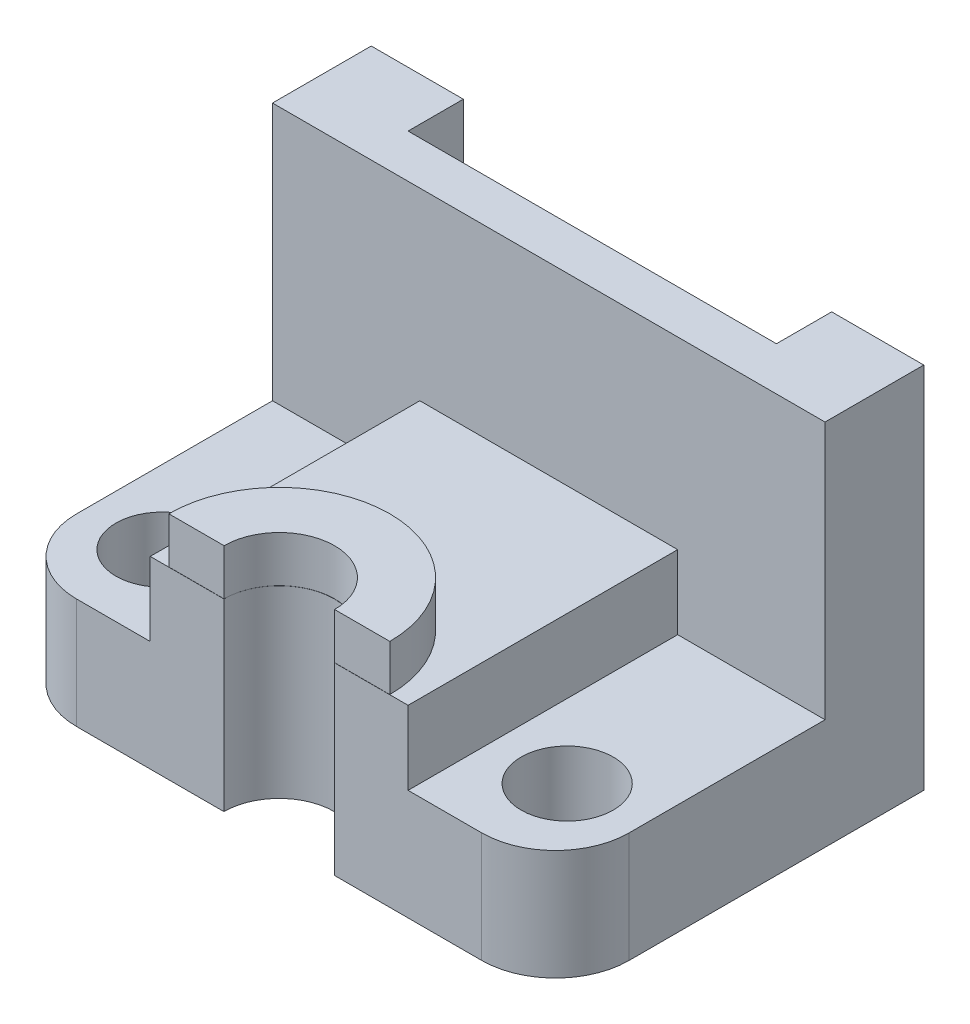
ISO-10303-21;
HEADER;
FILE_DESCRIPTION(('STEP AP214'),'2;1');
FILE_NAME('part.step','',(''),(''),'','','');
FILE_SCHEMA(('AUTOMOTIVE_DESIGN { 1 0 10303 214 1 1 1 1 }'));
ENDSEC;
DATA;
#1=APPLICATION_CONTEXT('core data for automotive mechanical design processes');
#2=APPLICATION_PROTOCOL_DEFINITION('international standard','automotive_design',2000,#1);
#3=PRODUCT_CONTEXT('',#1,'mechanical');
#4=PRODUCT('Part','Part','',(#3));
#5=PRODUCT_RELATED_PRODUCT_CATEGORY('part','',(#4));
#6=PRODUCT_DEFINITION_FORMATION('','',#4);
#7=PRODUCT_DEFINITION_CONTEXT('part definition',#1,'design');
#8=PRODUCT_DEFINITION('design','',#6,#7);
#9=PRODUCT_DEFINITION_SHAPE('','',#8);
#10=(LENGTH_UNIT() NAMED_UNIT(*) SI_UNIT(.MILLI.,.METRE.));
#11=(NAMED_UNIT(*) PLANE_ANGLE_UNIT() SI_UNIT($,.RADIAN.));
#12=(NAMED_UNIT(*) SI_UNIT($,.STERADIAN.) SOLID_ANGLE_UNIT());
#13=UNCERTAINTY_MEASURE_WITH_UNIT(LENGTH_MEASURE(1.E-05),#10,'distance_accuracy_value','');
#14=(GEOMETRIC_REPRESENTATION_CONTEXT(3) GLOBAL_UNCERTAINTY_ASSIGNED_CONTEXT((#13)) GLOBAL_UNIT_ASSIGNED_CONTEXT((#10,
#11,#12)) REPRESENTATION_CONTEXT('',''));
#15=CARTESIAN_POINT('',(0.,0.,0.));
#16=DIRECTION('',(0.,0.,1.));
#17=DIRECTION('',(1.,0.,0.));
#18=AXIS2_PLACEMENT_3D('',#15,#16,#17);
#19=CARTESIAN_POINT('',(0.,40.,40.));
#20=DIRECTION('',(0.,0.,-1.));
#21=DIRECTION('',(-1.,0.,0.));
#22=AXIS2_PLACEMENT_3D('',#19,#20,#21);
#23=PLANE('',#22);
#24=DIRECTION('',(1.,0.,0.));
#25=VECTOR('',#24,1.);
#26=CARTESIAN_POINT('',(0.,0.,40.));
#27=LINE('',#26,#25);
#28=CARTESIAN_POINT('',(8.,0.,40.));
#29=VERTEX_POINT('',#28);
#30=CARTESIAN_POINT('',(24.,0.,40.));
#31=VERTEX_POINT('',#30);
#32=EDGE_CURVE('E214',#29,#31,#27,.T.);
#33=ORIENTED_EDGE('',*,*,#32,.T.);
#34=DIRECTION('',(0.,1.,0.));
#35=VECTOR('',#34,1.);
#36=CARTESIAN_POINT('',(24.,0.,40.));
#37=LINE('',#36,#35);
#38=CARTESIAN_POINT('',(24.,20.,40.));
#39=VERTEX_POINT('',#38);
#40=EDGE_CURVE('E193',#31,#39,#37,.T.);
#41=ORIENTED_EDGE('',*,*,#40,.T.);
#42=DIRECTION('',(-1.,0.,0.));
#43=VECTOR('',#42,1.);
#44=CARTESIAN_POINT('',(16.,20.,40.));
#45=LINE('',#44,#43);
#46=CARTESIAN_POINT('',(16.,20.,40.));
#47=VERTEX_POINT('',#46);
#48=EDGE_CURVE('E293',#39,#47,#45,.T.);
#49=ORIENTED_EDGE('',*,*,#48,.T.);
#50=DIRECTION('',(0.,-1.,0.));
#51=VECTOR('',#50,1.);
#52=CARTESIAN_POINT('',(16.,12.,40.));
#53=LINE('',#52,#51);
#54=CARTESIAN_POINT('',(16.,12.,40.));
#55=VERTEX_POINT('',#54);
#56=EDGE_CURVE('E290',#47,#55,#53,.T.);
#57=ORIENTED_EDGE('',*,*,#56,.T.);
#58=DIRECTION('',(-1.,0.,0.));
#59=VECTOR('',#58,1.);
#60=CARTESIAN_POINT('',(60.,12.,40.));
#61=LINE('',#60,#59);
#62=CARTESIAN_POINT('',(8.,12.,40.));
#63=VERTEX_POINT('',#62);
#64=EDGE_CURVE('E281',#55,#63,#61,.T.);
#65=ORIENTED_EDGE('',*,*,#64,.T.);
#66=DIRECTION('',(0.,-1.,0.));
#67=VECTOR('',#66,1.);
#68=CARTESIAN_POINT('',(8.,40.,40.));
#69=LINE('',#68,#67);
#70=EDGE_CURVE('E252',#63,#29,#69,.T.);
#71=ORIENTED_EDGE('',*,*,#70,.T.);
#72=EDGE_LOOP('',(#33,#41,#49,#57,#65,#71));
#73=FACE_BOUND('',#72,.T.);
#74=ADVANCED_FACE('F43',(#73),#23,.F.);
#75=CARTESIAN_POINT('',(0.,0.,0.));
#76=DIRECTION('',(0.,1.,0.));
#77=DIRECTION('',(0.,0.,1.));
#78=AXIS2_PLACEMENT_3D('',#75,#76,#77);
#79=PLANE('',#78);
#80=CARTESIAN_POINT('',(36.,0.,40.));
#81=VERTEX_POINT('',#80);
#82=CARTESIAN_POINT('',(52.,0.,40.));
#83=VERTEX_POINT('',#82);
#84=EDGE_CURVE('E203',#81,#83,#27,.T.);
#85=ORIENTED_EDGE('',*,*,#84,.F.);
#86=CARTESIAN_POINT('',(30.,0.,40.));
#87=DIRECTION('',(0.,1.,0.));
#88=DIRECTION('',(0.,0.,1.));
#89=AXIS2_PLACEMENT_3D('',#86,#87,#88);
#90=CIRCLE('',#89,6.);
#91=EDGE_CURVE('E190',#81,#31,#90,.T.);
#92=ORIENTED_EDGE('',*,*,#91,.T.);
#93=ORIENTED_EDGE('',*,*,#32,.F.);
#94=CARTESIAN_POINT('',(8.,0.,32.));
#95=DIRECTION('',(0.,1.,0.));
#96=DIRECTION('',(0.,0.,1.));
#97=AXIS2_PLACEMENT_3D('',#94,#95,#96);
#98=CIRCLE('',#97,8.);
#99=CARTESIAN_POINT('',(0.,0.,32.));
#100=VERTEX_POINT('',#99);
#101=EDGE_CURVE('E249',#29,#100,#98,.F.);
#102=ORIENTED_EDGE('',*,*,#101,.T.);
#103=DIRECTION('',(0.,0.,1.));
#104=VECTOR('',#103,1.);
#105=CARTESIAN_POINT('',(0.,0.,0.));
#106=LINE('',#105,#104);
#107=CARTESIAN_POINT('',(0.,0.,0.));
#108=VERTEX_POINT('',#107);
#109=EDGE_CURVE('E215',#108,#100,#106,.T.);
#110=ORIENTED_EDGE('',*,*,#109,.F.);
#111=DIRECTION('',(-1.,0.,0.));
#112=VECTOR('',#111,1.);
#113=CARTESIAN_POINT('',(0.,0.,0.));
#114=LINE('',#113,#112);
#115=CARTESIAN_POINT('',(10.,0.,0.));
#116=VERTEX_POINT('',#115);
#117=EDGE_CURVE('E223',#116,#108,#114,.T.);
#118=ORIENTED_EDGE('',*,*,#117,.F.);
#119=DIRECTION('',(0.,0.,1.));
#120=VECTOR('',#119,1.);
#121=CARTESIAN_POINT('',(10.,0.,6.));
#122=LINE('',#121,#120);
#123=CARTESIAN_POINT('',(10.,0.,6.));
#124=VERTEX_POINT('',#123);
#125=EDGE_CURVE('E309',#116,#124,#122,.T.);
#126=ORIENTED_EDGE('',*,*,#125,.T.);
#127=DIRECTION('',(1.,0.,0.));
#128=VECTOR('',#127,1.);
#129=CARTESIAN_POINT('',(50.,0.,6.));
#130=LINE('',#129,#128);
#131=CARTESIAN_POINT('',(50.,0.,6.));
#132=VERTEX_POINT('',#131);
#133=EDGE_CURVE('E312',#124,#132,#130,.T.);
#134=ORIENTED_EDGE('',*,*,#133,.T.);
#135=DIRECTION('',(0.,0.,-1.));
#136=VECTOR('',#135,1.);
#137=CARTESIAN_POINT('',(50.,0.,0.));
#138=LINE('',#137,#136);
#139=CARTESIAN_POINT('',(50.,0.,0.));
#140=VERTEX_POINT('',#139);
#141=EDGE_CURVE('E316',#132,#140,#138,.T.);
#142=ORIENTED_EDGE('',*,*,#141,.T.);
#143=CARTESIAN_POINT('',(60.,0.,0.));
#144=VERTEX_POINT('',#143);
#145=EDGE_CURVE('E224',#144,#140,#114,.T.);
#146=ORIENTED_EDGE('',*,*,#145,.F.);
#147=DIRECTION('',(0.,0.,-1.));
#148=VECTOR('',#147,1.);
#149=CARTESIAN_POINT('',(60.,0.,0.));
#150=LINE('',#149,#148);
#151=CARTESIAN_POINT('',(60.,0.,32.));
#152=VERTEX_POINT('',#151);
#153=EDGE_CURVE('E217',#152,#144,#150,.T.);
#154=ORIENTED_EDGE('',*,*,#153,.F.);
#155=CARTESIAN_POINT('',(52.,0.,32.));
#156=DIRECTION('',(0.,1.,0.));
#157=DIRECTION('',(0.,0.,1.));
#158=AXIS2_PLACEMENT_3D('',#155,#156,#157);
#159=CIRCLE('',#158,8.);
#160=EDGE_CURVE('E212',#152,#83,#159,.F.);
#161=ORIENTED_EDGE('',*,*,#160,.T.);
#162=EDGE_LOOP('',(#85,#92,#93,#102,#110,#118,#126,#134,#142,#146,#154,#161));
#163=FACE_BOUND('',#162,.T.);
#164=CARTESIAN_POINT('',(52.,0.,30.7227957161979));
#165=DIRECTION('',(0.,1.,0.));
#166=DIRECTION('',(0.,0.,1.));
#167=AXIS2_PLACEMENT_3D('',#164,#165,#166);
#168=CIRCLE('',#167,5.);
#169=CARTESIAN_POINT('',(52.,0.,35.7227957161979));
#170=VERTEX_POINT('',#169);
#171=EDGE_CURVE('E422',#170,#170,#168,.F.);
#172=ORIENTED_EDGE('',*,*,#171,.F.);
#173=EDGE_LOOP('',(#172));
#174=FACE_BOUND('',#173,.T.);
#175=CARTESIAN_POINT('',(8.,0.,30.7227957161979));
#176=DIRECTION('',(0.,1.,0.));
#177=DIRECTION('',(0.,0.,1.));
#178=AXIS2_PLACEMENT_3D('',#175,#176,#177);
#179=CIRCLE('',#178,5.);
#180=CARTESIAN_POINT('',(8.,0.,35.7227957161979));
#181=VERTEX_POINT('',#180);
#182=EDGE_CURVE('E418',#181,#181,#179,.T.);
#183=ORIENTED_EDGE('',*,*,#182,.T.);
#184=EDGE_LOOP('',(#183));
#185=FACE_BOUND('',#184,.T.);
#186=ADVANCED_FACE('F209',(#163,#174,#185),#79,.F.);
#187=CARTESIAN_POINT('',(60.,12.,10.7227957161979));
#188=DIRECTION('',(0.,-1.,0.));
#189=DIRECTION('',(0.,0.,-1.));
#190=AXIS2_PLACEMENT_3D('',#187,#188,#189);
#191=PLANE('',#190);
#192=CARTESIAN_POINT('',(8.,12.,30.7227957161979));
#193=DIRECTION('',(0.,1.,0.));
#194=DIRECTION('',(0.,0.,1.));
#195=AXIS2_PLACEMENT_3D('',#192,#193,#194);
#196=CIRCLE('',#195,5.);
#197=CARTESIAN_POINT('',(8.,12.,35.7227957161979));
#198=VERTEX_POINT('',#197);
#199=EDGE_CURVE('E425',#198,#198,#196,.T.);
#200=ORIENTED_EDGE('',*,*,#199,.F.);
#201=EDGE_LOOP('',(#200));
#202=FACE_BOUND('',#201,.T.);
#203=DIRECTION('',(0.,0.,1.));
#204=VECTOR('',#203,1.);
#205=CARTESIAN_POINT('',(0.,12.,10.7227957161979));
#206=LINE('',#205,#204);
#207=CARTESIAN_POINT('',(0.,12.,10.7227957161979));
#208=VERTEX_POINT('',#207);
#209=CARTESIAN_POINT('',(0.,12.,32.));
#210=VERTEX_POINT('',#209);
#211=EDGE_CURVE('E303',#208,#210,#206,.T.);
#212=ORIENTED_EDGE('',*,*,#211,.T.);
#213=CARTESIAN_POINT('',(8.,12.,32.));
#214=DIRECTION('',(0.,-1.,0.));
#215=DIRECTION('',(0.,0.,-1.));
#216=AXIS2_PLACEMENT_3D('',#213,#214,#215);
#217=CIRCLE('',#216,8.);
#218=EDGE_CURVE('E11',#210,#63,#217,.F.);
#219=ORIENTED_EDGE('',*,*,#218,.T.);
#220=ORIENTED_EDGE('',*,*,#64,.F.);
#221=DIRECTION('',(0.,0.,1.));
#222=VECTOR('',#221,1.);
#223=CARTESIAN_POINT('',(16.,12.,-0.002000000000002));
#224=LINE('',#223,#222);
#225=CARTESIAN_POINT('',(16.,12.,10.7227957161979));
#226=VERTEX_POINT('',#225);
#227=EDGE_CURVE('E294',#226,#55,#224,.T.);
#228=ORIENTED_EDGE('',*,*,#227,.F.);
#229=DIRECTION('',(-1.,0.,0.));
#230=VECTOR('',#229,1.);
#231=CARTESIAN_POINT('',(60.,12.,10.7227957161979));
#232=LINE('',#231,#230);
#233=EDGE_CURVE('E307',#226,#208,#232,.T.);
#234=ORIENTED_EDGE('',*,*,#233,.T.);
#235=EDGE_LOOP('',(#212,#219,#220,#228,#234));
#236=FACE_BOUND('',#235,.T.);
#237=ADVANCED_FACE('F377',(#202,#236),#191,.F.);
#238=CARTESIAN_POINT('',(0.,40.,0.));
#239=DIRECTION('',(0.,0.,1.));
#240=DIRECTION('',(1.,0.,0.));
#241=AXIS2_PLACEMENT_3D('',#238,#239,#240);
#242=PLANE('',#241);
#243=DIRECTION('',(-1.,0.,0.));
#244=VECTOR('',#243,1.);
#245=CARTESIAN_POINT('',(0.,40.,0.));
#246=LINE('',#245,#244);
#247=CARTESIAN_POINT('',(10.,40.,0.));
#248=VERTEX_POINT('',#247);
#249=CARTESIAN_POINT('',(0.,40.,0.));
#250=VERTEX_POINT('',#249);
#251=EDGE_CURVE('E336',#248,#250,#246,.T.);
#252=ORIENTED_EDGE('',*,*,#251,.F.);
#253=DIRECTION('',(0.,1.,0.));
#254=VECTOR('',#253,1.);
#255=CARTESIAN_POINT('',(10.,0.,0.));
#256=LINE('',#255,#254);
#257=EDGE_CURVE('E218',#116,#248,#256,.T.);
#258=ORIENTED_EDGE('',*,*,#257,.F.);
#259=ORIENTED_EDGE('',*,*,#117,.T.);
#260=DIRECTION('',(0.,-1.,0.));
#261=VECTOR('',#260,1.);
#262=CARTESIAN_POINT('',(0.,40.,0.));
#263=LINE('',#262,#261);
#264=EDGE_CURVE('E228',#250,#108,#263,.T.);
#265=ORIENTED_EDGE('',*,*,#264,.F.);
#266=EDGE_LOOP('',(#252,#258,#259,#265));
#267=FACE_BOUND('',#266,.T.);
#268=ADVANCED_FACE('F350',(#267),#242,.F.);
#269=CARTESIAN_POINT('',(0.,40.,0.));
#270=DIRECTION('',(1.,0.,0.));
#271=DIRECTION('',(0.,0.,-1.));
#272=AXIS2_PLACEMENT_3D('',#269,#270,#271);
#273=PLANE('',#272);
#274=ORIENTED_EDGE('',*,*,#109,.T.);
#275=DIRECTION('',(0.,-1.,0.));
#276=VECTOR('',#275,1.);
#277=CARTESIAN_POINT('',(0.,40.,32.));
#278=LINE('',#277,#276);
#279=EDGE_CURVE('E51',#100,#210,#278,.F.);
#280=ORIENTED_EDGE('',*,*,#279,.T.);
#281=ORIENTED_EDGE('',*,*,#211,.F.);
#282=DIRECTION('',(0.,-1.,0.));
#283=VECTOR('',#282,1.);
#284=CARTESIAN_POINT('',(0.,40.,10.7227957161979));
#285=LINE('',#284,#283);
#286=CARTESIAN_POINT('',(0.,40.,10.7227957161979));
#287=VERTEX_POINT('',#286);
#288=EDGE_CURVE('E289',#287,#208,#285,.T.);
#289=ORIENTED_EDGE('',*,*,#288,.F.);
#290=DIRECTION('',(0.,0.,1.));
#291=VECTOR('',#290,1.);
#292=CARTESIAN_POINT('',(0.,40.,0.));
#293=LINE('',#292,#291);
#294=EDGE_CURVE('E227',#250,#287,#293,.T.);
#295=ORIENTED_EDGE('',*,*,#294,.F.);
#296=ORIENTED_EDGE('',*,*,#264,.T.);
#297=EDGE_LOOP('',(#274,#280,#281,#289,#295,#296));
#298=FACE_BOUND('',#297,.T.);
#299=ADVANCED_FACE('F354',(#298),#273,.F.);
#300=CARTESIAN_POINT('',(44.,20.,40.));
#301=VERTEX_POINT('',#300);
#302=CARTESIAN_POINT('',(36.,20.,40.));
#303=VERTEX_POINT('',#302);
#304=EDGE_CURVE('E207',#301,#303,#45,.T.);
#305=ORIENTED_EDGE('',*,*,#304,.T.);
#306=DIRECTION('',(0.,1.,0.));
#307=VECTOR('',#306,1.);
#308=CARTESIAN_POINT('',(36.,0.,40.));
#309=LINE('',#308,#307);
#310=EDGE_CURVE('E58',#303,#81,#309,.F.);
#311=ORIENTED_EDGE('',*,*,#310,.T.);
#312=ORIENTED_EDGE('',*,*,#84,.T.);
#313=DIRECTION('',(0.,-1.,0.));
#314=VECTOR('',#313,1.);
#315=CARTESIAN_POINT('',(52.,40.,40.));
#316=LINE('',#315,#314);
#317=CARTESIAN_POINT('',(52.,12.,40.));
#318=VERTEX_POINT('',#317);
#319=EDGE_CURVE('E255',#83,#318,#316,.F.);
#320=ORIENTED_EDGE('',*,*,#319,.T.);
#321=CARTESIAN_POINT('',(44.,12.,40.));
#322=VERTEX_POINT('',#321);
#323=EDGE_CURVE('E268',#318,#322,#61,.T.);
#324=ORIENTED_EDGE('',*,*,#323,.T.);
#325=DIRECTION('',(0.,1.,0.));
#326=VECTOR('',#325,1.);
#327=CARTESIAN_POINT('',(44.,20.,40.));
#328=LINE('',#327,#326);
#329=EDGE_CURVE('E279',#322,#301,#328,.T.);
#330=ORIENTED_EDGE('',*,*,#329,.T.);
#331=EDGE_LOOP('',(#305,#311,#312,#320,#324,#330));
#332=FACE_BOUND('',#331,.T.);
#333=ADVANCED_FACE('F202',(#332),#23,.F.);
#334=CARTESIAN_POINT('',(60.,40.,0.));
#335=DIRECTION('',(-1.,0.,0.));
#336=DIRECTION('',(0.,0.,1.));
#337=AXIS2_PLACEMENT_3D('',#334,#335,#336);
#338=PLANE('',#337);
#339=DIRECTION('',(0.,0.,1.));
#340=VECTOR('',#339,1.);
#341=CARTESIAN_POINT('',(60.,12.,10.7227957161979));
#342=LINE('',#341,#340);
#343=CARTESIAN_POINT('',(60.,12.,10.7227957161979));
#344=VERTEX_POINT('',#343);
#345=CARTESIAN_POINT('',(60.,12.,32.));
#346=VERTEX_POINT('',#345);
#347=EDGE_CURVE('E265',#344,#346,#342,.T.);
#348=ORIENTED_EDGE('',*,*,#347,.T.);
#349=DIRECTION('',(0.,-1.,0.));
#350=VECTOR('',#349,1.);
#351=CARTESIAN_POINT('',(60.,40.,32.));
#352=LINE('',#351,#350);
#353=EDGE_CURVE('E246',#346,#152,#352,.T.);
#354=ORIENTED_EDGE('',*,*,#353,.T.);
#355=ORIENTED_EDGE('',*,*,#153,.T.);
#356=DIRECTION('',(0.,-1.,0.));
#357=VECTOR('',#356,1.);
#358=CARTESIAN_POINT('',(60.,40.,0.));
#359=LINE('',#358,#357);
#360=CARTESIAN_POINT('',(60.,40.,0.));
#361=VERTEX_POINT('',#360);
#362=EDGE_CURVE('E231',#361,#144,#359,.T.);
#363=ORIENTED_EDGE('',*,*,#362,.F.);
#364=DIRECTION('',(0.,0.,-1.));
#365=VECTOR('',#364,1.);
#366=CARTESIAN_POINT('',(60.,40.,0.));
#367=LINE('',#366,#365);
#368=CARTESIAN_POINT('',(60.,40.,10.7227957161979));
#369=VERTEX_POINT('',#368);
#370=EDGE_CURVE('E335',#369,#361,#367,.T.);
#371=ORIENTED_EDGE('',*,*,#370,.F.);
#372=DIRECTION('',(0.,-1.,0.));
#373=VECTOR('',#372,1.);
#374=CARTESIAN_POINT('',(60.,40.,10.7227957161979));
#375=LINE('',#374,#373);
#376=EDGE_CURVE('E274',#369,#344,#375,.T.);
#377=ORIENTED_EDGE('',*,*,#376,.T.);
#378=EDGE_LOOP('',(#348,#354,#355,#363,#371,#377));
#379=FACE_BOUND('',#378,.T.);
#380=ADVANCED_FACE('F272',(#379),#338,.F.);
#381=ORIENTED_EDGE('',*,*,#145,.T.);
#382=DIRECTION('',(0.,1.,0.));
#383=VECTOR('',#382,1.);
#384=CARTESIAN_POINT('',(50.,0.,0.));
#385=LINE('',#384,#383);
#386=CARTESIAN_POINT('',(50.,40.,0.));
#387=VERTEX_POINT('',#386);
#388=EDGE_CURVE('E327',#140,#387,#385,.T.);
#389=ORIENTED_EDGE('',*,*,#388,.T.);
#390=EDGE_CURVE('E232',#361,#387,#246,.T.);
#391=ORIENTED_EDGE('',*,*,#390,.F.);
#392=ORIENTED_EDGE('',*,*,#362,.T.);
#393=EDGE_LOOP('',(#381,#389,#391,#392));
#394=FACE_BOUND('',#393,.T.);
#395=ADVANCED_FACE('F362',(#394),#242,.F.);
#396=CARTESIAN_POINT('',(0.,40.,0.));
#397=DIRECTION('',(0.,1.,0.));
#398=DIRECTION('',(0.,0.,1.));
#399=AXIS2_PLACEMENT_3D('',#396,#397,#398);
#400=PLANE('',#399);
#401=DIRECTION('',(-1.,0.,0.));
#402=VECTOR('',#401,1.);
#403=CARTESIAN_POINT('',(60.,40.,10.7227957161979));
#404=LINE('',#403,#402);
#405=EDGE_CURVE('E275',#369,#287,#404,.T.);
#406=ORIENTED_EDGE('',*,*,#405,.F.);
#407=ORIENTED_EDGE('',*,*,#370,.T.);
#408=ORIENTED_EDGE('',*,*,#390,.T.);
#409=DIRECTION('',(0.,0.,-1.));
#410=VECTOR('',#409,1.);
#411=CARTESIAN_POINT('',(50.,40.,0.));
#412=LINE('',#411,#410);
#413=CARTESIAN_POINT('',(50.,40.,6.));
#414=VERTEX_POINT('',#413);
#415=EDGE_CURVE('E313',#414,#387,#412,.T.);
#416=ORIENTED_EDGE('',*,*,#415,.F.);
#417=DIRECTION('',(1.,0.,0.));
#418=VECTOR('',#417,1.);
#419=CARTESIAN_POINT('',(50.,40.,6.));
#420=LINE('',#419,#418);
#421=CARTESIAN_POINT('',(10.,40.,6.));
#422=VERTEX_POINT('',#421);
#423=EDGE_CURVE('E322',#422,#414,#420,.T.);
#424=ORIENTED_EDGE('',*,*,#423,.F.);
#425=DIRECTION('',(0.,0.,1.));
#426=VECTOR('',#425,1.);
#427=CARTESIAN_POINT('',(10.,40.,6.));
#428=LINE('',#427,#426);
#429=EDGE_CURVE('E280',#248,#422,#428,.T.);
#430=ORIENTED_EDGE('',*,*,#429,.F.);
#431=ORIENTED_EDGE('',*,*,#251,.T.);
#432=ORIENTED_EDGE('',*,*,#294,.T.);
#433=EDGE_LOOP('',(#406,#407,#408,#416,#424,#430,#431,#432));
#434=FACE_BOUND('',#433,.T.);
#435=ADVANCED_FACE('F345',(#434),#400,.T.);
#436=CARTESIAN_POINT('',(10.,0.,6.));
#437=DIRECTION('',(-1.,0.,0.));
#438=DIRECTION('',(0.,0.,1.));
#439=AXIS2_PLACEMENT_3D('',#436,#437,#438);
#440=PLANE('',#439);
#441=ORIENTED_EDGE('',*,*,#429,.T.);
#442=DIRECTION('',(0.,1.,0.));
#443=VECTOR('',#442,1.);
#444=CARTESIAN_POINT('',(10.,0.,6.));
#445=LINE('',#444,#443);
#446=EDGE_CURVE('E319',#124,#422,#445,.T.);
#447=ORIENTED_EDGE('',*,*,#446,.F.);
#448=ORIENTED_EDGE('',*,*,#125,.F.);
#449=ORIENTED_EDGE('',*,*,#257,.T.);
#450=EDGE_LOOP('',(#441,#447,#448,#449));
#451=FACE_BOUND('',#450,.T.);
#452=ADVANCED_FACE('F370',(#451),#440,.F.);
#453=CARTESIAN_POINT('',(50.,0.,0.));
#454=DIRECTION('',(1.,0.,0.));
#455=DIRECTION('',(0.,0.,-1.));
#456=AXIS2_PLACEMENT_3D('',#453,#454,#455);
#457=PLANE('',#456);
#458=ORIENTED_EDGE('',*,*,#415,.T.);
#459=ORIENTED_EDGE('',*,*,#388,.F.);
#460=ORIENTED_EDGE('',*,*,#141,.F.);
#461=DIRECTION('',(0.,1.,0.));
#462=VECTOR('',#461,1.);
#463=CARTESIAN_POINT('',(50.,0.,6.));
#464=LINE('',#463,#462);
#465=EDGE_CURVE('E330',#132,#414,#464,.T.);
#466=ORIENTED_EDGE('',*,*,#465,.T.);
#467=EDGE_LOOP('',(#458,#459,#460,#466));
#468=FACE_BOUND('',#467,.T.);
#469=ADVANCED_FACE('F364',(#468),#457,.F.);
#470=CARTESIAN_POINT('',(50.,0.,6.));
#471=DIRECTION('',(0.,0.,1.));
#472=DIRECTION('',(1.,0.,0.));
#473=AXIS2_PLACEMENT_3D('',#470,#471,#472);
#474=PLANE('',#473);
#475=ORIENTED_EDGE('',*,*,#423,.T.);
#476=ORIENTED_EDGE('',*,*,#465,.F.);
#477=ORIENTED_EDGE('',*,*,#133,.F.);
#478=ORIENTED_EDGE('',*,*,#446,.T.);
#479=EDGE_LOOP('',(#475,#476,#477,#478));
#480=FACE_BOUND('',#479,.T.);
#481=ADVANCED_FACE('F368',(#480),#474,.F.);
#482=CARTESIAN_POINT('',(52.,12.,30.7227957161979));
#483=DIRECTION('',(0.,1.,0.));
#484=DIRECTION('',(0.,0.,1.));
#485=AXIS2_PLACEMENT_3D('',#482,#483,#484);
#486=CIRCLE('',#485,5.);
#487=CARTESIAN_POINT('',(52.,12.,35.7227957161979));
#488=VERTEX_POINT('',#487);
#489=EDGE_CURVE('E419',#488,#488,#486,.F.);
#490=ORIENTED_EDGE('',*,*,#489,.T.);
#491=EDGE_LOOP('',(#490));
#492=FACE_BOUND('',#491,.T.);
#493=ORIENTED_EDGE('',*,*,#323,.F.);
#494=CARTESIAN_POINT('',(52.,12.,32.));
#495=DIRECTION('',(0.,-1.,0.));
#496=DIRECTION('',(0.,0.,-1.));
#497=AXIS2_PLACEMENT_3D('',#494,#495,#496);
#498=CIRCLE('',#497,8.);
#499=EDGE_CURVE('E257',#318,#346,#498,.F.);
#500=ORIENTED_EDGE('',*,*,#499,.T.);
#501=ORIENTED_EDGE('',*,*,#347,.F.);
#502=CARTESIAN_POINT('',(44.,12.,10.7227957161979));
#503=VERTEX_POINT('',#502);
#504=EDGE_CURVE('E292',#344,#503,#232,.T.);
#505=ORIENTED_EDGE('',*,*,#504,.T.);
#506=DIRECTION('',(0.,0.,1.));
#507=VECTOR('',#506,1.);
#508=CARTESIAN_POINT('',(44.,12.,-0.002000000000002));
#509=LINE('',#508,#507);
#510=EDGE_CURVE('E285',#503,#322,#509,.T.);
#511=ORIENTED_EDGE('',*,*,#510,.T.);
#512=EDGE_LOOP('',(#493,#500,#501,#505,#511));
#513=FACE_BOUND('',#512,.T.);
#514=ADVANCED_FACE('F263',(#492,#513),#191,.F.);
#515=CARTESIAN_POINT('',(60.,40.,10.7227957161979));
#516=DIRECTION('',(0.,0.,-1.));
#517=DIRECTION('',(0.,1.,0.));
#518=AXIS2_PLACEMENT_3D('',#515,#516,#517);
#519=PLANE('',#518);
#520=ORIENTED_EDGE('',*,*,#233,.F.);
#521=DIRECTION('',(0.,-1.,0.));
#522=VECTOR('',#521,1.);
#523=CARTESIAN_POINT('',(16.,12.,10.7227957161979));
#524=LINE('',#523,#522);
#525=CARTESIAN_POINT('',(16.,20.,10.7227957161979));
#526=VERTEX_POINT('',#525);
#527=EDGE_CURVE('E389',#526,#226,#524,.T.);
#528=ORIENTED_EDGE('',*,*,#527,.F.);
#529=DIRECTION('',(-1.,0.,0.));
#530=VECTOR('',#529,1.);
#531=CARTESIAN_POINT('',(16.,20.,10.7227957161979));
#532=LINE('',#531,#530);
#533=CARTESIAN_POINT('',(44.,20.,10.7227957161979));
#534=VERTEX_POINT('',#533);
#535=EDGE_CURVE('E394',#534,#526,#532,.T.);
#536=ORIENTED_EDGE('',*,*,#535,.F.);
#537=DIRECTION('',(0.,1.,0.));
#538=VECTOR('',#537,1.);
#539=CARTESIAN_POINT('',(44.,20.,10.7227957161979));
#540=LINE('',#539,#538);
#541=EDGE_CURVE('E396',#503,#534,#540,.T.);
#542=ORIENTED_EDGE('',*,*,#541,.F.);
#543=ORIENTED_EDGE('',*,*,#504,.F.);
#544=ORIENTED_EDGE('',*,*,#376,.F.);
#545=ORIENTED_EDGE('',*,*,#405,.T.);
#546=ORIENTED_EDGE('',*,*,#288,.T.);
#547=EDGE_LOOP('',(#520,#528,#536,#542,#543,#544,#545,#546));
#548=FACE_BOUND('',#547,.T.);
#549=ADVANCED_FACE('F357',(#548),#519,.F.);
#550=CARTESIAN_POINT('',(16.,12.,-0.002000000000002));
#551=DIRECTION('',(-1.,0.,0.));
#552=DIRECTION('',(0.,0.,1.));
#553=AXIS2_PLACEMENT_3D('',#550,#551,#552);
#554=PLANE('',#553);
#555=DIRECTION('',(0.,0.,1.));
#556=VECTOR('',#555,1.);
#557=CARTESIAN_POINT('',(16.,20.,-0.002000000000002));
#558=LINE('',#557,#556);
#559=EDGE_CURVE('E297',#526,#47,#558,.T.);
#560=ORIENTED_EDGE('',*,*,#559,.F.);
#561=ORIENTED_EDGE('',*,*,#527,.T.);
#562=ORIENTED_EDGE('',*,*,#227,.T.);
#563=ORIENTED_EDGE('',*,*,#56,.F.);
#564=EDGE_LOOP('',(#560,#561,#562,#563));
#565=FACE_BOUND('',#564,.T.);
#566=ADVANCED_FACE('F395',(#565),#554,.T.);
#567=CARTESIAN_POINT('',(16.,20.,-0.002000000000002));
#568=DIRECTION('',(0.,1.,0.));
#569=DIRECTION('',(0.,0.,1.));
#570=AXIS2_PLACEMENT_3D('',#567,#568,#569);
#571=PLANE('',#570);
#572=CARTESIAN_POINT('',(30.,20.,40.));
#573=DIRECTION('',(0.,1.,0.));
#574=DIRECTION('',(0.,0.,1.));
#575=AXIS2_PLACEMENT_3D('',#572,#573,#574);
#576=CIRCLE('',#575,6.);
#577=EDGE_CURVE('E198',#303,#39,#576,.T.);
#578=ORIENTED_EDGE('',*,*,#577,.F.);
#579=ORIENTED_EDGE('',*,*,#304,.F.);
#580=DIRECTION('',(0.,0.,1.));
#581=VECTOR('',#580,1.);
#582=CARTESIAN_POINT('',(44.,20.,-0.002000000000002));
#583=LINE('',#582,#581);
#584=EDGE_CURVE('E288',#534,#301,#583,.T.);
#585=ORIENTED_EDGE('',*,*,#584,.F.);
#586=ORIENTED_EDGE('',*,*,#535,.T.);
#587=ORIENTED_EDGE('',*,*,#559,.T.);
#588=ORIENTED_EDGE('',*,*,#48,.F.);
#589=EDGE_LOOP('',(#578,#579,#585,#586,#587,#588));
#590=FACE_BOUND('',#589,.T.);
#591=DIRECTION('',(1.,0.,0.));
#592=VECTOR('',#591,1.);
#593=CARTESIAN_POINT('',(16.,20.,39.9809337265948));
#594=LINE('',#593,#592);
#595=CARTESIAN_POINT('',(36.,20.,39.9809337265948));
#596=VERTEX_POINT('',#595);
#597=CARTESIAN_POINT('',(42.,20.,39.9809337265948));
#598=VERTEX_POINT('',#597);
#599=EDGE_CURVE('E243',#596,#598,#594,.T.);
#600=ORIENTED_EDGE('',*,*,#599,.F.);
#601=CARTESIAN_POINT('',(30.,20.,39.9809337265948));
#602=DIRECTION('',(0.,1.,0.));
#603=DIRECTION('',(0.,0.,1.));
#604=AXIS2_PLACEMENT_3D('',#601,#602,#603);
#605=CIRCLE('',#604,6.);
#606=CARTESIAN_POINT('',(24.,20.,39.9809337265948));
#607=VERTEX_POINT('',#606);
#608=EDGE_CURVE('E241',#596,#607,#605,.T.);
#609=ORIENTED_EDGE('',*,*,#608,.T.);
#610=DIRECTION('',(1.,0.,0.));
#611=VECTOR('',#610,1.);
#612=CARTESIAN_POINT('',(16.,20.,39.9809337265948));
#613=LINE('',#612,#611);
#614=CARTESIAN_POINT('',(18.,20.,39.9809337265948));
#615=VERTEX_POINT('',#614);
#616=EDGE_CURVE('E238',#615,#607,#613,.T.);
#617=ORIENTED_EDGE('',*,*,#616,.F.);
#618=CARTESIAN_POINT('',(30.,20.,39.9809337265948));
#619=DIRECTION('',(0.,1.,0.));
#620=DIRECTION('',(0.,0.,1.));
#621=AXIS2_PLACEMENT_3D('',#618,#619,#620);
#622=CIRCLE('',#621,12.);
#623=EDGE_CURVE('E235',#598,#615,#622,.T.);
#624=ORIENTED_EDGE('',*,*,#623,.F.);
#625=EDGE_LOOP('',(#600,#609,#617,#624));
#626=FACE_BOUND('',#625,.T.);
#627=ADVANCED_FACE('F391',(#590,#626),#571,.T.);
#628=CARTESIAN_POINT('',(44.,20.,-0.002000000000002));
#629=DIRECTION('',(1.,0.,0.));
#630=DIRECTION('',(0.,0.,-1.));
#631=AXIS2_PLACEMENT_3D('',#628,#629,#630);
#632=PLANE('',#631);
#633=ORIENTED_EDGE('',*,*,#510,.F.);
#634=ORIENTED_EDGE('',*,*,#541,.T.);
#635=ORIENTED_EDGE('',*,*,#584,.T.);
#636=ORIENTED_EDGE('',*,*,#329,.F.);
#637=EDGE_LOOP('',(#633,#634,#635,#636));
#638=FACE_BOUND('',#637,.T.);
#639=ADVANCED_FACE('F284',(#638),#632,.T.);
#640=CARTESIAN_POINT('',(0.,-26.8328157299975,39.9809337265948));
#641=DIRECTION('',(0.,0.,1.));
#642=DIRECTION('',(1.,0.,0.));
#643=AXIS2_PLACEMENT_3D('',#640,#641,#642);
#644=PLANE('',#643);
#645=DIRECTION('',(0.,1.,0.));
#646=VECTOR('',#645,1.);
#647=CARTESIAN_POINT('',(36.,-26.8328157299975,39.9809337265948));
#648=LINE('',#647,#646);
#649=CARTESIAN_POINT('',(36.,25.,39.9809337265948));
#650=VERTEX_POINT('',#649);
#651=EDGE_CURVE('E400',#596,#650,#648,.T.);
#652=ORIENTED_EDGE('',*,*,#651,.F.);
#653=ORIENTED_EDGE('',*,*,#599,.T.);
#654=DIRECTION('',(0.,1.,0.));
#655=VECTOR('',#654,1.);
#656=CARTESIAN_POINT('',(42.,-26.8328157299975,39.9809337265948));
#657=LINE('',#656,#655);
#658=CARTESIAN_POINT('',(42.,25.,39.9809337265948));
#659=VERTEX_POINT('',#658);
#660=EDGE_CURVE('E401',#598,#659,#657,.T.);
#661=ORIENTED_EDGE('',*,*,#660,.T.);
#662=DIRECTION('',(1.,0.,0.));
#663=VECTOR('',#662,1.);
#664=CARTESIAN_POINT('',(0.,25.,39.9809337265948));
#665=LINE('',#664,#663);
#666=EDGE_CURVE('E415',#650,#659,#665,.T.);
#667=ORIENTED_EDGE('',*,*,#666,.F.);
#668=EDGE_LOOP('',(#652,#653,#661,#667));
#669=FACE_BOUND('',#668,.T.);
#670=ADVANCED_FACE('F490',(#669),#644,.T.);
#671=CARTESIAN_POINT('',(30.,-26.8328157299975,39.9809337265948));
#672=DIRECTION('',(0.,1.,0.));
#673=DIRECTION('',(0.,0.,1.));
#674=AXIS2_PLACEMENT_3D('',#671,#672,#673);
#675=CYLINDRICAL_SURFACE('',#674,6.);
#676=ORIENTED_EDGE('',*,*,#608,.F.);
#677=ORIENTED_EDGE('',*,*,#651,.T.);
#678=CARTESIAN_POINT('',(30.,25.,39.9809337265948));
#679=DIRECTION('',(0.,1.,0.));
#680=DIRECTION('',(0.,0.,1.));
#681=AXIS2_PLACEMENT_3D('',#678,#679,#680);
#682=CIRCLE('',#681,6.);
#683=CARTESIAN_POINT('',(24.,25.,39.9809337265948));
#684=VERTEX_POINT('',#683);
#685=EDGE_CURVE('E404',#650,#684,#682,.T.);
#686=ORIENTED_EDGE('',*,*,#685,.T.);
#687=DIRECTION('',(0.,1.,0.));
#688=VECTOR('',#687,1.);
#689=CARTESIAN_POINT('',(24.,-26.8328157299975,39.9809337265948));
#690=LINE('',#689,#688);
#691=EDGE_CURVE('E406',#607,#684,#690,.T.);
#692=ORIENTED_EDGE('',*,*,#691,.F.);
#693=EDGE_LOOP('',(#676,#677,#686,#692));
#694=FACE_BOUND('',#693,.T.);
#695=ADVANCED_FACE('F486',(#694),#675,.F.);
#696=DIRECTION('',(0.,1.,0.));
#697=VECTOR('',#696,1.);
#698=CARTESIAN_POINT('',(18.,-26.8328157299975,39.9809337265948));
#699=LINE('',#698,#697);
#700=CARTESIAN_POINT('',(18.,25.,39.9809337265948));
#701=VERTEX_POINT('',#700);
#702=EDGE_CURVE('E403',#615,#701,#699,.T.);
#703=ORIENTED_EDGE('',*,*,#702,.F.);
#704=ORIENTED_EDGE('',*,*,#616,.T.);
#705=ORIENTED_EDGE('',*,*,#691,.T.);
#706=EDGE_CURVE('E411',#701,#684,#665,.T.);
#707=ORIENTED_EDGE('',*,*,#706,.F.);
#708=EDGE_LOOP('',(#703,#704,#705,#707));
#709=FACE_BOUND('',#708,.T.);
#710=ADVANCED_FACE('F489',(#709),#644,.T.);
#711=CARTESIAN_POINT('',(30.,-26.8328157299975,39.9809337265948));
#712=DIRECTION('',(0.,1.,0.));
#713=DIRECTION('',(0.,0.,1.));
#714=AXIS2_PLACEMENT_3D('',#711,#712,#713);
#715=CYLINDRICAL_SURFACE('',#714,12.);
#716=ORIENTED_EDGE('',*,*,#660,.F.);
#717=ORIENTED_EDGE('',*,*,#623,.T.);
#718=ORIENTED_EDGE('',*,*,#702,.T.);
#719=CARTESIAN_POINT('',(30.,25.,39.9809337265948));
#720=DIRECTION('',(0.,1.,0.));
#721=DIRECTION('',(0.,0.,1.));
#722=AXIS2_PLACEMENT_3D('',#719,#720,#721);
#723=CIRCLE('',#722,12.);
#724=EDGE_CURVE('E412',#659,#701,#723,.T.);
#725=ORIENTED_EDGE('',*,*,#724,.F.);
#726=EDGE_LOOP('',(#716,#717,#718,#725));
#727=FACE_BOUND('',#726,.T.);
#728=ADVANCED_FACE('F484',(#727),#715,.T.);
#729=CARTESIAN_POINT('',(0.,25.,0.));
#730=DIRECTION('',(0.,1.,0.));
#731=DIRECTION('',(0.,0.,1.));
#732=AXIS2_PLACEMENT_3D('',#729,#730,#731);
#733=PLANE('',#732);
#734=ORIENTED_EDGE('',*,*,#666,.T.);
#735=ORIENTED_EDGE('',*,*,#724,.T.);
#736=ORIENTED_EDGE('',*,*,#706,.T.);
#737=ORIENTED_EDGE('',*,*,#685,.F.);
#738=EDGE_LOOP('',(#734,#735,#736,#737));
#739=FACE_BOUND('',#738,.T.);
#740=ADVANCED_FACE('F480',(#739),#733,.T.);
#741=CARTESIAN_POINT('',(52.,0.,30.7227957161979));
#742=DIRECTION('',(0.,1.,0.));
#743=DIRECTION('',(0.,0.,1.));
#744=AXIS2_PLACEMENT_3D('',#741,#742,#743);
#745=CYLINDRICAL_SURFACE('',#744,5.);
#746=ORIENTED_EDGE('',*,*,#171,.T.);
#747=EDGE_LOOP('',(#746));
#748=FACE_BOUND('',#747,.T.);
#749=ORIENTED_EDGE('',*,*,#489,.F.);
#750=EDGE_LOOP('',(#749));
#751=FACE_BOUND('',#750,.T.);
#752=ADVANCED_FACE('F437',(#748,#751),#745,.F.);
#753=CARTESIAN_POINT('',(8.,0.,30.7227957161979));
#754=DIRECTION('',(0.,1.,0.));
#755=DIRECTION('',(0.,0.,1.));
#756=AXIS2_PLACEMENT_3D('',#753,#754,#755);
#757=CYLINDRICAL_SURFACE('',#756,5.);
#758=ORIENTED_EDGE('',*,*,#182,.F.);
#759=EDGE_LOOP('',(#758));
#760=FACE_BOUND('',#759,.T.);
#761=ORIENTED_EDGE('',*,*,#199,.T.);
#762=EDGE_LOOP('',(#761));
#763=FACE_BOUND('',#762,.T.);
#764=ADVANCED_FACE('F434',(#760,#763),#757,.F.);
#765=CARTESIAN_POINT('',(52.,40.,32.));
#766=DIRECTION('',(0.,-1.,0.));
#767=DIRECTION('',(0.,0.,-1.));
#768=AXIS2_PLACEMENT_3D('',#765,#766,#767);
#769=CYLINDRICAL_SURFACE('',#768,8.);
#770=ORIENTED_EDGE('',*,*,#499,.F.);
#771=ORIENTED_EDGE('',*,*,#319,.F.);
#772=ORIENTED_EDGE('',*,*,#160,.F.);
#773=ORIENTED_EDGE('',*,*,#353,.F.);
#774=EDGE_LOOP('',(#770,#771,#772,#773));
#775=FACE_BOUND('',#774,.T.);
#776=ADVANCED_FACE('F277',(#775),#769,.T.);
#777=CARTESIAN_POINT('',(8.,40.,32.));
#778=DIRECTION('',(0.,-1.,0.));
#779=DIRECTION('',(0.,0.,-1.));
#780=AXIS2_PLACEMENT_3D('',#777,#778,#779);
#781=CYLINDRICAL_SURFACE('',#780,8.);
#782=ORIENTED_EDGE('',*,*,#218,.F.);
#783=ORIENTED_EDGE('',*,*,#279,.F.);
#784=ORIENTED_EDGE('',*,*,#101,.F.);
#785=ORIENTED_EDGE('',*,*,#70,.F.);
#786=EDGE_LOOP('',(#782,#783,#784,#785));
#787=FACE_BOUND('',#786,.T.);
#788=ADVANCED_FACE('F45',(#787),#781,.T.);
#789=CARTESIAN_POINT('',(30.,0.,40.));
#790=DIRECTION('',(0.,1.,0.));
#791=DIRECTION('',(0.,0.,1.));
#792=AXIS2_PLACEMENT_3D('',#789,#790,#791);
#793=CYLINDRICAL_SURFACE('',#792,6.);
#794=ORIENTED_EDGE('',*,*,#91,.F.);
#795=ORIENTED_EDGE('',*,*,#310,.F.);
#796=ORIENTED_EDGE('',*,*,#577,.T.);
#797=ORIENTED_EDGE('',*,*,#40,.F.);
#798=EDGE_LOOP('',(#794,#795,#796,#797));
#799=FACE_BOUND('',#798,.T.);
#800=ADVANCED_FACE('F191',(#799),#793,.F.);
#801=CLOSED_SHELL('',(#74,#186,#237,#268,#299,#333,#380,#395,#435,#452,#469,#481,#514,#549,#566,
#627,#639,#670,#695,#710,#728,#740,#752,#764,#776,#788,#800));
#802=MANIFOLD_SOLID_BREP('B2',#801);
#803=ADVANCED_BREP_SHAPE_REPRESENTATION('',(#18,#802),#14);
#804=SHAPE_DEFINITION_REPRESENTATION(#9,#803);
ENDSEC;
END-ISO-10303-21;
